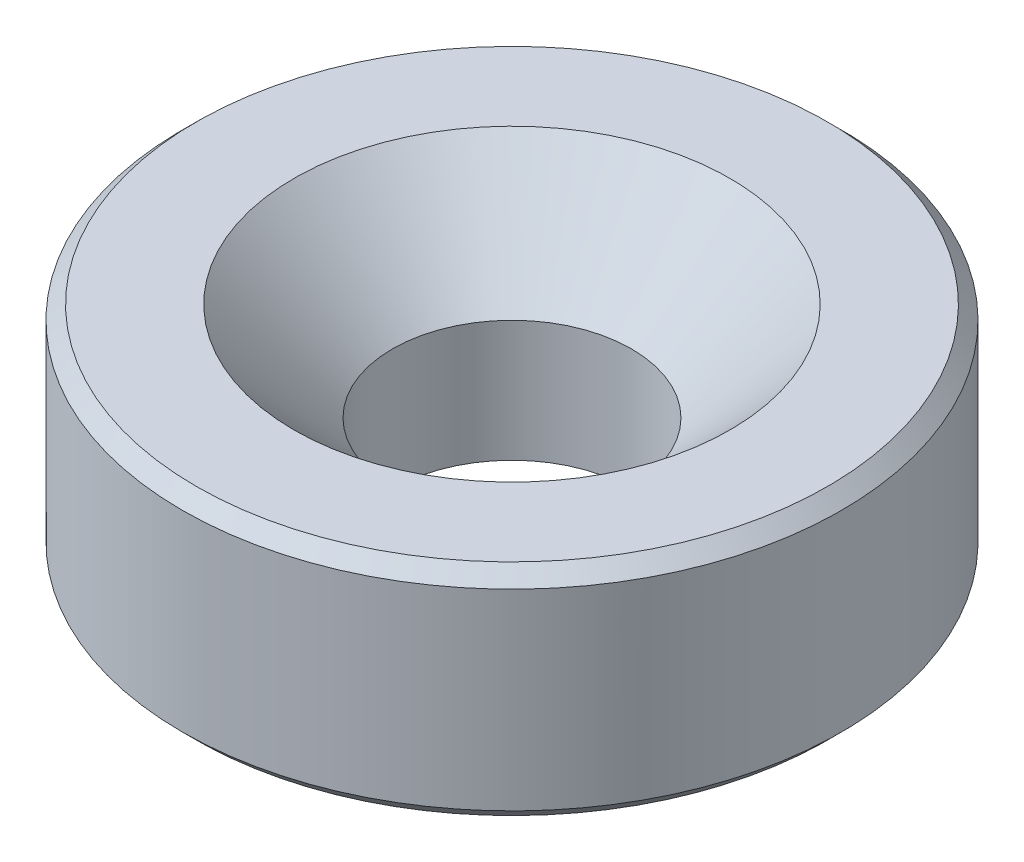
ISO-10303-21;
HEADER;
FILE_DESCRIPTION(('STEP AP214'),'2;1');
FILE_NAME('part.step','',(''),(''),'','','');
FILE_SCHEMA(('AUTOMOTIVE_DESIGN { 1 0 10303 214 1 1 1 1 }'));
ENDSEC;
DATA;
#1=APPLICATION_CONTEXT('core data for automotive mechanical design processes');
#2=APPLICATION_PROTOCOL_DEFINITION('international standard','automotive_design',2000,#1);
#3=PRODUCT_CONTEXT('',#1,'mechanical');
#4=PRODUCT('Part','Part','',(#3));
#5=PRODUCT_RELATED_PRODUCT_CATEGORY('part','',(#4));
#6=PRODUCT_DEFINITION_FORMATION('','',#4);
#7=PRODUCT_DEFINITION_CONTEXT('part definition',#1,'design');
#8=PRODUCT_DEFINITION('design','',#6,#7);
#9=PRODUCT_DEFINITION_SHAPE('','',#8);
#10=(LENGTH_UNIT() NAMED_UNIT(*) SI_UNIT(.MILLI.,.METRE.));
#11=(NAMED_UNIT(*) PLANE_ANGLE_UNIT() SI_UNIT($,.RADIAN.));
#12=(NAMED_UNIT(*) SI_UNIT($,.STERADIAN.) SOLID_ANGLE_UNIT());
#13=UNCERTAINTY_MEASURE_WITH_UNIT(LENGTH_MEASURE(1.E-05),#10,'distance_accuracy_value','');
#14=(GEOMETRIC_REPRESENTATION_CONTEXT(3) GLOBAL_UNCERTAINTY_ASSIGNED_CONTEXT((#13)) GLOBAL_UNIT_ASSIGNED_CONTEXT((#10,
#11,#12)) REPRESENTATION_CONTEXT('',''));
#15=CARTESIAN_POINT('',(0.,0.,0.));
#16=DIRECTION('',(0.,0.,1.));
#17=DIRECTION('',(1.,0.,0.));
#18=AXIS2_PLACEMENT_3D('',#15,#16,#17);
#19=CARTESIAN_POINT('',(-4.7625,0.,0.));
#20=DIRECTION('',(0.,-1.,0.));
#21=DIRECTION('',(0.,0.,-1.));
#22=AXIS2_PLACEMENT_3D('',#19,#20,#21);
#23=PLANE('',#22);
#24=CARTESIAN_POINT('',(0.,0.,0.));
#25=DIRECTION('',(0.,-1.,0.));
#26=DIRECTION('',(0.,0.,-1.));
#27=AXIS2_PLACEMENT_3D('',#24,#25,#26);
#28=CIRCLE('',#27,4.5625);
#29=CARTESIAN_POINT('',(0.,0.,-4.5625));
#30=VERTEX_POINT('',#29);
#31=EDGE_CURVE('E49',#30,#30,#28,.T.);
#32=ORIENTED_EDGE('',*,*,#31,.T.);
#33=EDGE_LOOP('',(#32));
#34=FACE_BOUND('',#33,.T.);
#35=CARTESIAN_POINT('',(0.,0.,0.));
#36=DIRECTION('',(0.,1.,0.));
#37=DIRECTION('',(0.,0.,1.));
#38=AXIS2_PLACEMENT_3D('',#35,#36,#37);
#39=CIRCLE('',#38,1.7272);
#40=CARTESIAN_POINT('',(0.,0.,1.7272));
#41=VERTEX_POINT('',#40);
#42=EDGE_CURVE('E62',#41,#41,#39,.T.);
#43=ORIENTED_EDGE('',*,*,#42,.T.);
#44=EDGE_LOOP('',(#43));
#45=FACE_BOUND('',#44,.T.);
#46=ADVANCED_FACE('F41',(#34,#45),#23,.T.);
#47=CARTESIAN_POINT('',(0.,0.,0.));
#48=DIRECTION('',(0.,1.,0.));
#49=DIRECTION('',(0.,0.,1.));
#50=AXIS2_PLACEMENT_3D('',#47,#48,#49);
#51=CYLINDRICAL_SURFACE('',#50,1.7272);
#52=CARTESIAN_POINT('',(0.,1.7522,0.));
#53=DIRECTION('',(0.,1.,0.));
#54=DIRECTION('',(0.,0.,1.));
#55=AXIS2_PLACEMENT_3D('',#52,#53,#54);
#56=CIRCLE('',#55,1.7272);
#57=CARTESIAN_POINT('',(0.,1.7522,1.7272));
#58=VERTEX_POINT('',#57);
#59=EDGE_CURVE('E65',#58,#58,#56,.T.);
#60=ORIENTED_EDGE('',*,*,#59,.T.);
#61=EDGE_LOOP('',(#60));
#62=FACE_BOUND('',#61,.T.);
#63=ORIENTED_EDGE('',*,*,#42,.F.);
#64=EDGE_LOOP('',(#63));
#65=FACE_BOUND('',#64,.T.);
#66=ADVANCED_FACE('F87',(#62,#65),#51,.F.);
#67=CARTESIAN_POINT('',(0.,1.7522,0.));
#68=DIRECTION('',(0.,1.,0.));
#69=DIRECTION('',(0.,0.,1.));
#70=AXIS2_PLACEMENT_3D('',#67,#68,#69);
#71=CONICAL_SURFACE('',#70,1.7272,0.78539816339745);
#72=CARTESIAN_POINT('',(0.,3.175,0.));
#73=DIRECTION('',(0.,1.,0.));
#74=DIRECTION('',(0.,0.,1.));
#75=AXIS2_PLACEMENT_3D('',#72,#73,#74);
#76=CIRCLE('',#75,3.15);
#77=CARTESIAN_POINT('',(0.,3.175,3.15));
#78=VERTEX_POINT('',#77);
#79=EDGE_CURVE('E68',#78,#78,#76,.T.);
#80=ORIENTED_EDGE('',*,*,#79,.T.);
#81=EDGE_LOOP('',(#80));
#82=FACE_BOUND('',#81,.T.);
#83=ORIENTED_EDGE('',*,*,#59,.F.);
#84=EDGE_LOOP('',(#83));
#85=FACE_BOUND('',#84,.T.);
#86=ADVANCED_FACE('F72',(#82,#85),#71,.F.);
#87=CARTESIAN_POINT('',(-3.15,3.175,0.));
#88=DIRECTION('',(0.,1.,0.));
#89=DIRECTION('',(0.,0.,1.));
#90=AXIS2_PLACEMENT_3D('',#87,#88,#89);
#91=PLANE('',#90);
#92=CARTESIAN_POINT('',(0.,3.175,0.));
#93=DIRECTION('',(0.,1.,0.));
#94=DIRECTION('',(0.,0.,1.));
#95=AXIS2_PLACEMENT_3D('',#92,#93,#94);
#96=CIRCLE('',#95,4.5625);
#97=CARTESIAN_POINT('',(0.,3.175,4.5625));
#98=VERTEX_POINT('',#97);
#99=EDGE_CURVE('E10',#98,#98,#96,.T.);
#100=ORIENTED_EDGE('',*,*,#99,.T.);
#101=EDGE_LOOP('',(#100));
#102=FACE_BOUND('',#101,.T.);
#103=ORIENTED_EDGE('',*,*,#79,.F.);
#104=EDGE_LOOP('',(#103));
#105=FACE_BOUND('',#104,.T.);
#106=ADVANCED_FACE('F75',(#102,#105),#91,.T.);
#107=CARTESIAN_POINT('',(0.,0.,0.));
#108=DIRECTION('',(0.,1.,0.));
#109=DIRECTION('',(0.,0.,1.));
#110=AXIS2_PLACEMENT_3D('',#107,#108,#109);
#111=CYLINDRICAL_SURFACE('',#110,4.7625);
#112=CARTESIAN_POINT('',(0.,0.199999999999997,0.));
#113=DIRECTION('',(0.,-1.,0.));
#114=DIRECTION('',(0.,0.,-1.));
#115=AXIS2_PLACEMENT_3D('',#112,#113,#114);
#116=CIRCLE('',#115,4.7625);
#117=CARTESIAN_POINT('',(0.,0.199999999999997,-4.7625));
#118=VERTEX_POINT('',#117);
#119=EDGE_CURVE('E53',#118,#118,#116,.F.);
#120=ORIENTED_EDGE('',*,*,#119,.T.);
#121=EDGE_LOOP('',(#120));
#122=FACE_BOUND('',#121,.T.);
#123=CARTESIAN_POINT('',(0.,2.975,0.));
#124=DIRECTION('',(0.,1.,0.));
#125=DIRECTION('',(0.,0.,1.));
#126=AXIS2_PLACEMENT_3D('',#123,#124,#125);
#127=CIRCLE('',#126,4.7625);
#128=CARTESIAN_POINT('',(0.,2.975,4.7625));
#129=VERTEX_POINT('',#128);
#130=EDGE_CURVE('E57',#129,#129,#127,.F.);
#131=ORIENTED_EDGE('',*,*,#130,.T.);
#132=EDGE_LOOP('',(#131));
#133=FACE_BOUND('',#132,.T.);
#134=ADVANCED_FACE('F77',(#122,#133),#111,.T.);
#135=CARTESIAN_POINT('',(0.,0.199999999999997,0.));
#136=DIRECTION('',(0.,1.,0.));
#137=DIRECTION('',(0.,0.,1.));
#138=AXIS2_PLACEMENT_3D('',#135,#136,#137);
#139=CONICAL_SURFACE('',#138,4.7625,0.785398163397448);
#140=ORIENTED_EDGE('',*,*,#31,.F.);
#141=EDGE_LOOP('',(#140));
#142=FACE_BOUND('',#141,.T.);
#143=ORIENTED_EDGE('',*,*,#119,.F.);
#144=EDGE_LOOP('',(#143));
#145=FACE_BOUND('',#144,.T.);
#146=ADVANCED_FACE('F83',(#142,#145),#139,.T.);
#147=CARTESIAN_POINT('',(0.,3.175,0.));
#148=DIRECTION('',(0.,-1.,0.));
#149=DIRECTION('',(0.,0.,-1.));
#150=AXIS2_PLACEMENT_3D('',#147,#148,#149);
#151=CONICAL_SURFACE('',#150,4.5625,0.785398163397444);
#152=ORIENTED_EDGE('',*,*,#130,.F.);
#153=EDGE_LOOP('',(#152));
#154=FACE_BOUND('',#153,.T.);
#155=ORIENTED_EDGE('',*,*,#99,.F.);
#156=EDGE_LOOP('',(#155));
#157=FACE_BOUND('',#156,.T.);
#158=ADVANCED_FACE('F44',(#154,#157),#151,.T.);
#159=CLOSED_SHELL('',(#46,#66,#86,#106,#134,#146,#158));
#160=MANIFOLD_SOLID_BREP('B2',#159);
#161=ADVANCED_BREP_SHAPE_REPRESENTATION('',(#18,#160),#14);
#162=SHAPE_DEFINITION_REPRESENTATION(#9,#161);
ENDSEC;
END-ISO-10303-21;
